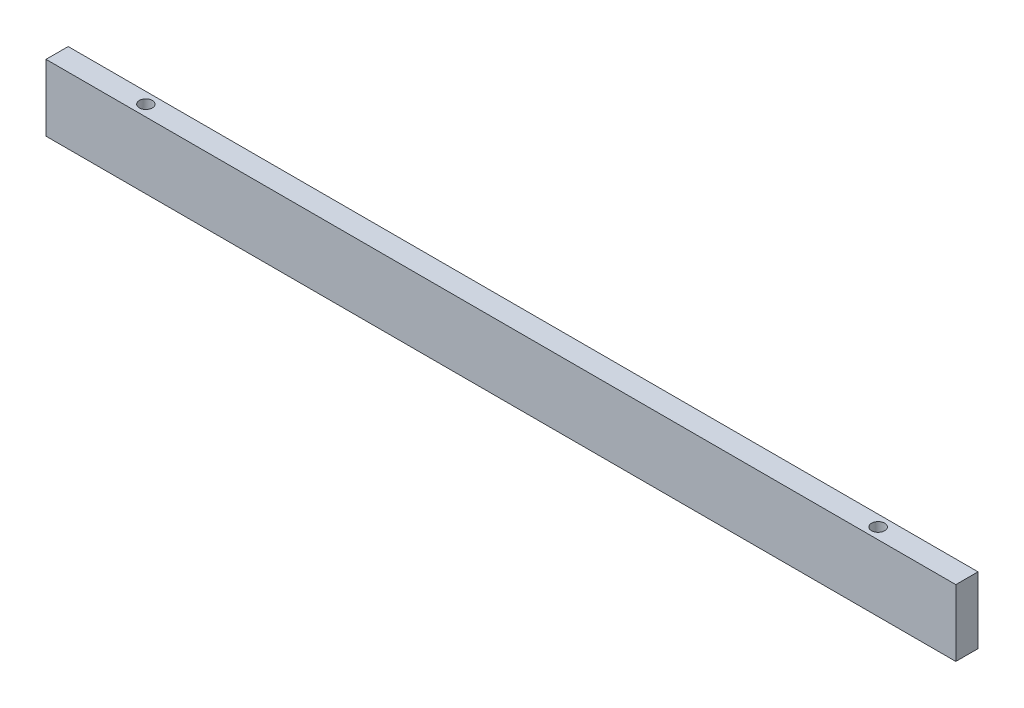
ISO-10303-21;
HEADER;
FILE_DESCRIPTION(('STEP AP214'),'2;1');
FILE_NAME('part.step','',(''),(''),'','','');
FILE_SCHEMA(('AUTOMOTIVE_DESIGN { 1 0 10303 214 1 1 1 1 }'));
ENDSEC;
DATA;
#1=APPLICATION_CONTEXT('core data for automotive mechanical design processes');
#2=APPLICATION_PROTOCOL_DEFINITION('international standard','automotive_design',2000,#1);
#3=PRODUCT_CONTEXT('',#1,'mechanical');
#4=PRODUCT('Part','Part','',(#3));
#5=PRODUCT_RELATED_PRODUCT_CATEGORY('part','',(#4));
#6=PRODUCT_DEFINITION_FORMATION('','',#4);
#7=PRODUCT_DEFINITION_CONTEXT('part definition',#1,'design');
#8=PRODUCT_DEFINITION('design','',#6,#7);
#9=PRODUCT_DEFINITION_SHAPE('','',#8);
#10=(LENGTH_UNIT() NAMED_UNIT(*) SI_UNIT(.MILLI.,.METRE.));
#11=(NAMED_UNIT(*) PLANE_ANGLE_UNIT() SI_UNIT($,.RADIAN.));
#12=(NAMED_UNIT(*) SI_UNIT($,.STERADIAN.) SOLID_ANGLE_UNIT());
#13=UNCERTAINTY_MEASURE_WITH_UNIT(LENGTH_MEASURE(1.E-05),#10,'distance_accuracy_value','');
#14=(GEOMETRIC_REPRESENTATION_CONTEXT(3) GLOBAL_UNCERTAINTY_ASSIGNED_CONTEXT((#13)) GLOBAL_UNIT_ASSIGNED_CONTEXT((#10,
#11,#12)) REPRESENTATION_CONTEXT('',''));
#15=CARTESIAN_POINT('',(0.,0.,0.));
#16=DIRECTION('',(0.,0.,1.));
#17=DIRECTION('',(1.,0.,0.));
#18=AXIS2_PLACEMENT_3D('',#15,#16,#17);
#19=CARTESIAN_POINT('',(0.,-19.05,6.35));
#20=DIRECTION('',(1.,0.,0.));
#21=DIRECTION('',(0.,0.,-1.));
#22=AXIS2_PLACEMENT_3D('',#19,#20,#21);
#23=PLANE('',#22);
#24=DIRECTION('',(0.,-1.,0.));
#25=VECTOR('',#24,1.);
#26=CARTESIAN_POINT('',(0.,-19.05,0.));
#27=LINE('',#26,#25);
#28=CARTESIAN_POINT('',(0.,0.,0.));
#29=VERTEX_POINT('',#28);
#30=CARTESIAN_POINT('',(0.,-19.05,0.));
#31=VERTEX_POINT('',#30);
#32=EDGE_CURVE('E96',#29,#31,#27,.T.);
#33=ORIENTED_EDGE('',*,*,#32,.T.);
#34=DIRECTION('',(0.,0.,-1.));
#35=VECTOR('',#34,1.);
#36=CARTESIAN_POINT('',(0.,-19.05,6.35));
#37=LINE('',#36,#35);
#38=CARTESIAN_POINT('',(0.,-19.05,6.35));
#39=VERTEX_POINT('',#38);
#40=EDGE_CURVE('E11',#39,#31,#37,.T.);
#41=ORIENTED_EDGE('',*,*,#40,.F.);
#42=DIRECTION('',(0.,-1.,0.));
#43=VECTOR('',#42,1.);
#44=CARTESIAN_POINT('',(0.,-19.05,6.35));
#45=LINE('',#44,#43);
#46=CARTESIAN_POINT('',(0.,0.,6.35));
#47=VERTEX_POINT('',#46);
#48=EDGE_CURVE('E84',#47,#39,#45,.T.);
#49=ORIENTED_EDGE('',*,*,#48,.F.);
#50=DIRECTION('',(0.,0.,-1.));
#51=VECTOR('',#50,1.);
#52=CARTESIAN_POINT('',(0.,0.,6.35));
#53=LINE('',#52,#51);
#54=EDGE_CURVE('E92',#47,#29,#53,.T.);
#55=ORIENTED_EDGE('',*,*,#54,.T.);
#56=EDGE_LOOP('',(#33,#41,#49,#55));
#57=FACE_BOUND('',#56,.T.);
#58=ADVANCED_FACE('F33',(#57),#23,.F.);
#59=CARTESIAN_POINT('',(260.35,-19.05,6.35));
#60=DIRECTION('',(0.,1.,0.));
#61=DIRECTION('',(0.,0.,1.));
#62=AXIS2_PLACEMENT_3D('',#59,#60,#61);
#63=PLANE('',#62);
#64=CARTESIAN_POINT('',(222.25,-19.05,3.175));
#65=DIRECTION('',(0.,-1.,0.));
#66=DIRECTION('',(0.,0.,-1.));
#67=AXIS2_PLACEMENT_3D('',#64,#65,#66);
#68=CIRCLE('',#67,1.84999064753542);
#69=CARTESIAN_POINT('',(222.25,-19.05,1.32500935246458));
#70=VERTEX_POINT('',#69);
#71=EDGE_CURVE('E128',#70,#70,#68,.T.);
#72=ORIENTED_EDGE('',*,*,#71,.F.);
#73=EDGE_LOOP('',(#72));
#74=FACE_BOUND('',#73,.T.);
#75=CARTESIAN_POINT('',(38.1,-19.05,3.175));
#76=DIRECTION('',(0.,-1.,0.));
#77=DIRECTION('',(0.,0.,-1.));
#78=AXIS2_PLACEMENT_3D('',#75,#76,#77);
#79=CIRCLE('',#78,1.84999064753533);
#80=CARTESIAN_POINT('',(38.1,-19.05,1.32500935246467));
#81=VERTEX_POINT('',#80);
#82=EDGE_CURVE('E122',#81,#81,#79,.T.);
#83=ORIENTED_EDGE('',*,*,#82,.F.);
#84=EDGE_LOOP('',(#83));
#85=FACE_BOUND('',#84,.T.);
#86=DIRECTION('',(1.,0.,0.));
#87=VECTOR('',#86,1.);
#88=CARTESIAN_POINT('',(260.35,-19.05,0.));
#89=LINE('',#88,#87);
#90=CARTESIAN_POINT('',(260.35,-19.05,0.));
#91=VERTEX_POINT('',#90);
#92=EDGE_CURVE('E88',#31,#91,#89,.T.);
#93=ORIENTED_EDGE('',*,*,#92,.T.);
#94=DIRECTION('',(0.,0.,-1.));
#95=VECTOR('',#94,1.);
#96=CARTESIAN_POINT('',(260.35,-19.05,6.35));
#97=LINE('',#96,#95);
#98=CARTESIAN_POINT('',(260.35,-19.05,6.35));
#99=VERTEX_POINT('',#98);
#100=EDGE_CURVE('E41',#99,#91,#97,.T.);
#101=ORIENTED_EDGE('',*,*,#100,.F.);
#102=DIRECTION('',(1.,0.,0.));
#103=VECTOR('',#102,1.);
#104=CARTESIAN_POINT('',(260.35,-19.05,6.35));
#105=LINE('',#104,#103);
#106=EDGE_CURVE('E79',#39,#99,#105,.T.);
#107=ORIENTED_EDGE('',*,*,#106,.F.);
#108=ORIENTED_EDGE('',*,*,#40,.T.);
#109=EDGE_LOOP('',(#93,#101,#107,#108));
#110=FACE_BOUND('',#109,.T.);
#111=ADVANCED_FACE('F87',(#74,#85,#110),#63,.F.);
#112=CARTESIAN_POINT('',(260.35,0.,6.35));
#113=DIRECTION('',(-1.,0.,0.));
#114=DIRECTION('',(0.,0.,1.));
#115=AXIS2_PLACEMENT_3D('',#112,#113,#114);
#116=PLANE('',#115);
#117=DIRECTION('',(0.,1.,0.));
#118=VECTOR('',#117,1.);
#119=CARTESIAN_POINT('',(260.35,0.,0.));
#120=LINE('',#119,#118);
#121=CARTESIAN_POINT('',(260.35,0.,0.));
#122=VERTEX_POINT('',#121);
#123=EDGE_CURVE('E66',#91,#122,#120,.T.);
#124=ORIENTED_EDGE('',*,*,#123,.T.);
#125=DIRECTION('',(0.,0.,-1.));
#126=VECTOR('',#125,1.);
#127=CARTESIAN_POINT('',(260.35,0.,6.35));
#128=LINE('',#127,#126);
#129=CARTESIAN_POINT('',(260.35,0.,6.35));
#130=VERTEX_POINT('',#129);
#131=EDGE_CURVE('E89',#130,#122,#128,.T.);
#132=ORIENTED_EDGE('',*,*,#131,.F.);
#133=DIRECTION('',(0.,1.,0.));
#134=VECTOR('',#133,1.);
#135=CARTESIAN_POINT('',(260.35,0.,6.35));
#136=LINE('',#135,#134);
#137=EDGE_CURVE('E82',#99,#130,#136,.T.);
#138=ORIENTED_EDGE('',*,*,#137,.F.);
#139=ORIENTED_EDGE('',*,*,#100,.T.);
#140=EDGE_LOOP('',(#124,#132,#138,#139));
#141=FACE_BOUND('',#140,.T.);
#142=ADVANCED_FACE('F90',(#141),#116,.F.);
#143=CARTESIAN_POINT('',(0.,0.,6.35));
#144=DIRECTION('',(0.,-1.,0.));
#145=DIRECTION('',(0.,0.,-1.));
#146=AXIS2_PLACEMENT_3D('',#143,#144,#145);
#147=PLANE('',#146);
#148=CARTESIAN_POINT('',(234.95,0.,3.175));
#149=DIRECTION('',(0.,1.,0.));
#150=DIRECTION('',(0.,0.,1.));
#151=AXIS2_PLACEMENT_3D('',#148,#149,#150);
#152=CIRCLE('',#151,1.8835826200961);
#153=CARTESIAN_POINT('',(234.95,0.,5.0585826200961));
#154=VERTEX_POINT('',#153);
#155=EDGE_CURVE('E117',#154,#154,#152,.T.);
#156=ORIENTED_EDGE('',*,*,#155,.F.);
#157=EDGE_LOOP('',(#156));
#158=FACE_BOUND('',#157,.T.);
#159=CARTESIAN_POINT('',(25.4,0.,3.175));
#160=DIRECTION('',(0.,1.,0.));
#161=DIRECTION('',(0.,0.,1.));
#162=AXIS2_PLACEMENT_3D('',#159,#160,#161);
#163=CIRCLE('',#162,1.86645328183582);
#164=CARTESIAN_POINT('',(25.4,0.,5.04145328183582));
#165=VERTEX_POINT('',#164);
#166=EDGE_CURVE('E110',#165,#165,#163,.T.);
#167=ORIENTED_EDGE('',*,*,#166,.F.);
#168=EDGE_LOOP('',(#167));
#169=FACE_BOUND('',#168,.T.);
#170=DIRECTION('',(-1.,0.,0.));
#171=VECTOR('',#170,1.);
#172=CARTESIAN_POINT('',(0.,0.,0.));
#173=LINE('',#172,#171);
#174=EDGE_CURVE('E72',#122,#29,#173,.T.);
#175=ORIENTED_EDGE('',*,*,#174,.T.);
#176=ORIENTED_EDGE('',*,*,#54,.F.);
#177=DIRECTION('',(-1.,0.,0.));
#178=VECTOR('',#177,1.);
#179=CARTESIAN_POINT('',(0.,0.,6.35));
#180=LINE('',#179,#178);
#181=EDGE_CURVE('E49',#130,#47,#180,.T.);
#182=ORIENTED_EDGE('',*,*,#181,.F.);
#183=ORIENTED_EDGE('',*,*,#131,.T.);
#184=EDGE_LOOP('',(#175,#176,#182,#183));
#185=FACE_BOUND('',#184,.T.);
#186=ADVANCED_FACE('F104',(#158,#169,#185),#147,.F.);
#187=CARTESIAN_POINT('',(0.,0.,6.35));
#188=DIRECTION('',(0.,0.,-1.));
#189=DIRECTION('',(-1.,0.,0.));
#190=AXIS2_PLACEMENT_3D('',#187,#188,#189);
#191=PLANE('',#190);
#192=ORIENTED_EDGE('',*,*,#48,.T.);
#193=ORIENTED_EDGE('',*,*,#106,.T.);
#194=ORIENTED_EDGE('',*,*,#137,.T.);
#195=ORIENTED_EDGE('',*,*,#181,.T.);
#196=EDGE_LOOP('',(#192,#193,#194,#195));
#197=FACE_BOUND('',#196,.T.);
#198=ADVANCED_FACE('F80',(#197),#191,.F.);
#199=CARTESIAN_POINT('',(0.,0.,0.));
#200=DIRECTION('',(0.,0.,-1.));
#201=DIRECTION('',(-1.,0.,0.));
#202=AXIS2_PLACEMENT_3D('',#199,#200,#201);
#203=PLANE('',#202);
#204=ORIENTED_EDGE('',*,*,#32,.F.);
#205=ORIENTED_EDGE('',*,*,#174,.F.);
#206=ORIENTED_EDGE('',*,*,#123,.F.);
#207=ORIENTED_EDGE('',*,*,#92,.F.);
#208=EDGE_LOOP('',(#204,#205,#206,#207));
#209=FACE_BOUND('',#208,.T.);
#210=ADVANCED_FACE('F107',(#209),#203,.T.);
#211=CARTESIAN_POINT('',(25.4,-6.35,3.175));
#212=DIRECTION('',(0.,1.,0.));
#213=DIRECTION('',(0.,0.,1.));
#214=AXIS2_PLACEMENT_3D('',#211,#212,#213);
#215=CYLINDRICAL_SURFACE('',#214,1.86645328183582);
#216=CARTESIAN_POINT('',(25.4,-6.35,3.175));
#217=DIRECTION('',(0.,1.,0.));
#218=DIRECTION('',(0.,0.,1.));
#219=AXIS2_PLACEMENT_3D('',#216,#217,#218);
#220=CIRCLE('',#219,1.86645328183582);
#221=CARTESIAN_POINT('',(25.4,-6.35,5.04145328183582));
#222=VERTEX_POINT('',#221);
#223=EDGE_CURVE('E113',#222,#222,#220,.T.);
#224=ORIENTED_EDGE('',*,*,#223,.F.);
#225=EDGE_LOOP('',(#224));
#226=FACE_BOUND('',#225,.T.);
#227=ORIENTED_EDGE('',*,*,#166,.T.);
#228=EDGE_LOOP('',(#227));
#229=FACE_BOUND('',#228,.T.);
#230=ADVANCED_FACE('F196',(#226,#229),#215,.F.);
#231=CARTESIAN_POINT('',(25.4,-6.35,3.175));
#232=DIRECTION('',(0.,1.,0.));
#233=DIRECTION('',(0.,0.,1.));
#234=AXIS2_PLACEMENT_3D('',#231,#232,#233);
#235=PLANE('',#234);
#236=ORIENTED_EDGE('',*,*,#223,.T.);
#237=EDGE_LOOP('',(#236));
#238=FACE_BOUND('',#237,.T.);
#239=ADVANCED_FACE('F202',(#238),#235,.T.);
#240=CARTESIAN_POINT('',(234.95,-6.35,3.175));
#241=DIRECTION('',(0.,1.,0.));
#242=DIRECTION('',(0.,0.,1.));
#243=AXIS2_PLACEMENT_3D('',#240,#241,#242);
#244=CYLINDRICAL_SURFACE('',#243,1.8835826200961);
#245=CARTESIAN_POINT('',(234.95,-6.35,3.175));
#246=DIRECTION('',(0.,1.,0.));
#247=DIRECTION('',(0.,0.,1.));
#248=AXIS2_PLACEMENT_3D('',#245,#246,#247);
#249=CIRCLE('',#248,1.8835826200961);
#250=CARTESIAN_POINT('',(234.95,-6.35,5.0585826200961));
#251=VERTEX_POINT('',#250);
#252=EDGE_CURVE('E99',#251,#251,#249,.T.);
#253=ORIENTED_EDGE('',*,*,#252,.F.);
#254=EDGE_LOOP('',(#253));
#255=FACE_BOUND('',#254,.T.);
#256=ORIENTED_EDGE('',*,*,#155,.T.);
#257=EDGE_LOOP('',(#256));
#258=FACE_BOUND('',#257,.T.);
#259=ADVANCED_FACE('F158',(#255,#258),#244,.F.);
#260=CARTESIAN_POINT('',(234.95,-6.35,3.175));
#261=DIRECTION('',(0.,1.,0.));
#262=DIRECTION('',(0.,0.,1.));
#263=AXIS2_PLACEMENT_3D('',#260,#261,#262);
#264=PLANE('',#263);
#265=ORIENTED_EDGE('',*,*,#252,.T.);
#266=EDGE_LOOP('',(#265));
#267=FACE_BOUND('',#266,.T.);
#268=ADVANCED_FACE('F149',(#267),#264,.T.);
#269=CARTESIAN_POINT('',(38.1,-12.7,3.175));
#270=DIRECTION('',(0.,-1.,0.));
#271=DIRECTION('',(0.,0.,-1.));
#272=AXIS2_PLACEMENT_3D('',#269,#270,#271);
#273=CYLINDRICAL_SURFACE('',#272,1.84999064753533);
#274=CARTESIAN_POINT('',(38.1,-12.7,3.175));
#275=DIRECTION('',(0.,-1.,0.));
#276=DIRECTION('',(0.,0.,-1.));
#277=AXIS2_PLACEMENT_3D('',#274,#275,#276);
#278=CIRCLE('',#277,1.84999064753533);
#279=CARTESIAN_POINT('',(38.1,-12.7,1.32500935246467));
#280=VERTEX_POINT('',#279);
#281=EDGE_CURVE('E125',#280,#280,#278,.T.);
#282=ORIENTED_EDGE('',*,*,#281,.F.);
#283=EDGE_LOOP('',(#282));
#284=FACE_BOUND('',#283,.T.);
#285=ORIENTED_EDGE('',*,*,#82,.T.);
#286=EDGE_LOOP('',(#285));
#287=FACE_BOUND('',#286,.T.);
#288=ADVANCED_FACE('F147',(#284,#287),#273,.F.);
#289=CARTESIAN_POINT('',(38.1,-12.7,3.175));
#290=DIRECTION('',(0.,-1.,0.));
#291=DIRECTION('',(0.,0.,-1.));
#292=AXIS2_PLACEMENT_3D('',#289,#290,#291);
#293=PLANE('',#292);
#294=ORIENTED_EDGE('',*,*,#281,.T.);
#295=EDGE_LOOP('',(#294));
#296=FACE_BOUND('',#295,.T.);
#297=ADVANCED_FACE('F139',(#296),#293,.T.);
#298=CARTESIAN_POINT('',(222.25,-12.7,3.175));
#299=DIRECTION('',(0.,-1.,0.));
#300=DIRECTION('',(0.,0.,-1.));
#301=AXIS2_PLACEMENT_3D('',#298,#299,#300);
#302=CYLINDRICAL_SURFACE('',#301,1.84999064753542);
#303=CARTESIAN_POINT('',(222.25,-12.7,3.175));
#304=DIRECTION('',(0.,-1.,0.));
#305=DIRECTION('',(0.,0.,-1.));
#306=AXIS2_PLACEMENT_3D('',#303,#304,#305);
#307=CIRCLE('',#306,1.84999064753542);
#308=CARTESIAN_POINT('',(222.25,-12.7,1.32500935246458));
#309=VERTEX_POINT('',#308);
#310=EDGE_CURVE('E114',#309,#309,#307,.T.);
#311=ORIENTED_EDGE('',*,*,#310,.F.);
#312=EDGE_LOOP('',(#311));
#313=FACE_BOUND('',#312,.T.);
#314=ORIENTED_EDGE('',*,*,#71,.T.);
#315=EDGE_LOOP('',(#314));
#316=FACE_BOUND('',#315,.T.);
#317=ADVANCED_FACE('F136',(#313,#316),#302,.F.);
#318=CARTESIAN_POINT('',(222.25,-12.7,3.175));
#319=DIRECTION('',(0.,-1.,0.));
#320=DIRECTION('',(0.,0.,-1.));
#321=AXIS2_PLACEMENT_3D('',#318,#319,#320);
#322=PLANE('',#321);
#323=ORIENTED_EDGE('',*,*,#310,.T.);
#324=EDGE_LOOP('',(#323));
#325=FACE_BOUND('',#324,.T.);
#326=ADVANCED_FACE('F134',(#325),#322,.T.);
#327=CLOSED_SHELL('',(#58,#111,#142,#186,#198,#210,#230,#239,#259,#268,#288,#297,#317,#326));
#328=MANIFOLD_SOLID_BREP('B2',#327);
#329=ADVANCED_BREP_SHAPE_REPRESENTATION('',(#18,#328),#14);
#330=SHAPE_DEFINITION_REPRESENTATION(#9,#329);
ENDSEC;
END-ISO-10303-21;
